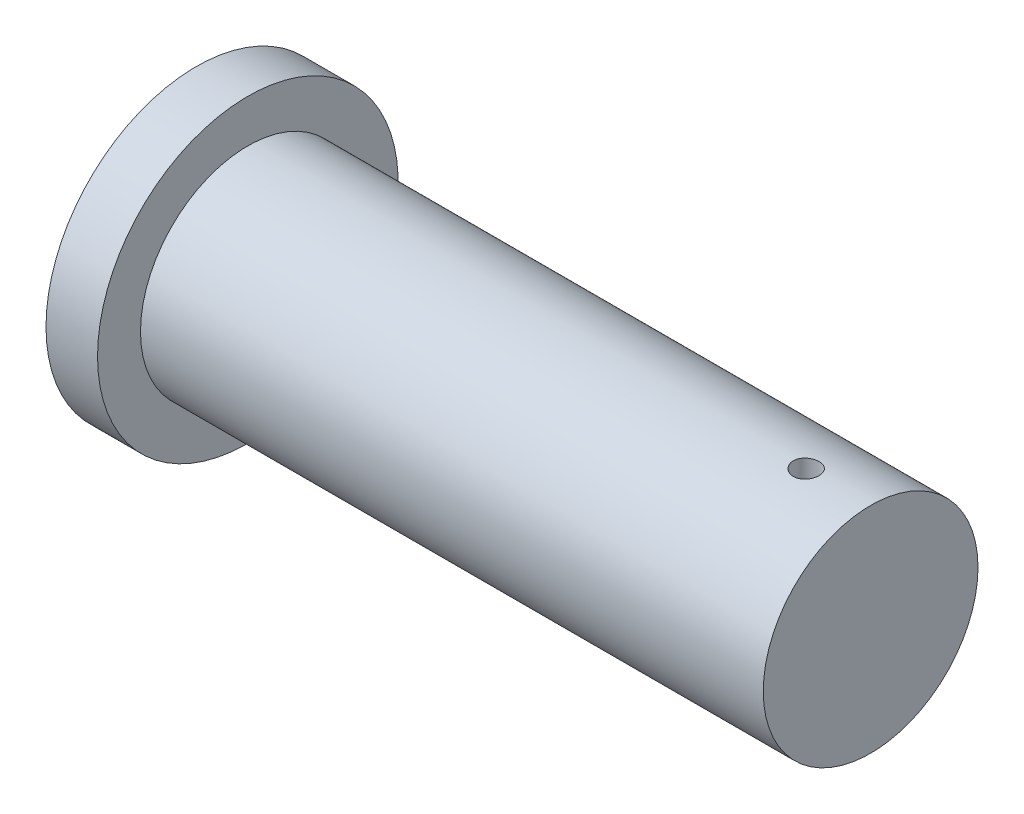
ISO-10303-21;
HEADER;
FILE_DESCRIPTION(('STEP AP214'),'2;1');
FILE_NAME('part.step','',(''),(''),'','','');
FILE_SCHEMA(('AUTOMOTIVE_DESIGN { 1 0 10303 214 1 1 1 1 }'));
ENDSEC;
DATA;
#1=APPLICATION_CONTEXT('core data for automotive mechanical design processes');
#2=APPLICATION_PROTOCOL_DEFINITION('international standard','automotive_design',2000,#1);
#3=PRODUCT_CONTEXT('',#1,'mechanical');
#4=PRODUCT('Part','Part','',(#3));
#5=PRODUCT_RELATED_PRODUCT_CATEGORY('part','',(#4));
#6=PRODUCT_DEFINITION_FORMATION('','',#4);
#7=PRODUCT_DEFINITION_CONTEXT('part definition',#1,'design');
#8=PRODUCT_DEFINITION('design','',#6,#7);
#9=PRODUCT_DEFINITION_SHAPE('','',#8);
#10=(LENGTH_UNIT() NAMED_UNIT(*) SI_UNIT(.MILLI.,.METRE.));
#11=(NAMED_UNIT(*) PLANE_ANGLE_UNIT() SI_UNIT($,.RADIAN.));
#12=(NAMED_UNIT(*) SI_UNIT($,.STERADIAN.) SOLID_ANGLE_UNIT());
#13=UNCERTAINTY_MEASURE_WITH_UNIT(LENGTH_MEASURE(1.E-05),#10,'distance_accuracy_value','');
#14=(GEOMETRIC_REPRESENTATION_CONTEXT(3) GLOBAL_UNCERTAINTY_ASSIGNED_CONTEXT((#13)) GLOBAL_UNIT_ASSIGNED_CONTEXT((#10,
#11,#12)) REPRESENTATION_CONTEXT('',''));
#15=CARTESIAN_POINT('',(0.,0.,0.));
#16=DIRECTION('',(0.,0.,1.));
#17=DIRECTION('',(1.,0.,0.));
#18=AXIS2_PLACEMENT_3D('',#15,#16,#17);
#19=CARTESIAN_POINT('',(0.,0.,0.));
#20=DIRECTION('',(-1.,0.,0.));
#21=DIRECTION('',(0.,0.,1.));
#22=AXIS2_PLACEMENT_3D('',#19,#20,#21);
#23=PLANE('',#22);
#24=CARTESIAN_POINT('',(0.,0.,0.));
#25=DIRECTION('',(-1.,0.,0.));
#26=DIRECTION('',(0.,0.,1.));
#27=AXIS2_PLACEMENT_3D('',#24,#25,#26);
#28=CIRCLE('',#27,25.);
#29=CARTESIAN_POINT('',(0.,0.,25.));
#30=VERTEX_POINT('',#29);
#31=EDGE_CURVE('E10',#30,#30,#28,.T.);
#32=ORIENTED_EDGE('',*,*,#31,.F.);
#33=EDGE_LOOP('',(#32));
#34=FACE_BOUND('',#33,.T.);
#35=ADVANCED_FACE('F37',(#34),#23,.F.);
#36=CARTESIAN_POINT('',(-157.,0.,0.));
#37=DIRECTION('',(-1.,0.,0.));
#38=DIRECTION('',(0.,0.,1.));
#39=AXIS2_PLACEMENT_3D('',#36,#37,#38);
#40=CYLINDRICAL_SURFACE('',#39,25.);
#41=CARTESIAN_POINT('',(-15.,-24.8193472919817,3.));
#42=CARTESIAN_POINT('',(-14.8321408588001,-24.819349617552,2.99999283172714));
#43=CARTESIAN_POINT('',(-14.6641754798501,-24.8210685774632,2.98586413495824));
#44=CARTESIAN_POINT('',(-14.3329153879421,-24.8277564496115,2.92972318709126));
#45=CARTESIAN_POINT('',(-14.1696258043137,-24.8327287982131,2.88768145238964));
#46=CARTESIAN_POINT('',(-13.8525615944954,-24.8453523109071,2.77696834616031));
#47=CARTESIAN_POINT('',(-13.6987807388662,-24.8530016988386,2.708314627898));
#48=CARTESIAN_POINT('',(-13.4049528578965,-24.8701152498661,2.5463633755789));
#49=CARTESIAN_POINT('',(-13.2649034084313,-24.8795790917656,2.45307020212001));
#50=CARTESIAN_POINT('',(-13.0017602283905,-24.8993100054925,2.24397143930053));
#51=CARTESIAN_POINT('',(-12.8787477056515,-24.9095805816582,2.1280639725065));
#52=CARTESIAN_POINT('',(-12.6538712818379,-24.9297361585383,1.87724586434875));
#53=CARTESIAN_POINT('',(-12.5520084140581,-24.9396211403948,1.74233429505413));
#54=CARTESIAN_POINT('',(-12.3720334670637,-24.9579274023081,1.45682956846799));
#55=CARTESIAN_POINT('',(-12.2939945842603,-24.9663441380671,1.30618995384899));
#56=CARTESIAN_POINT('',(-12.1643515396152,-24.9807271243236,0.993825767272774));
#57=CARTESIAN_POINT('',(-12.1127464702522,-24.9866934589465,0.832101576085541));
#58=CARTESIAN_POINT('',(-12.0376777438965,-24.9954787324527,0.502987856985083));
#59=CARTESIAN_POINT('',(-12.0140793465542,-24.9983127364408,0.335629471043379));
#60=CARTESIAN_POINT('',(-11.9952764006894,-25.0005654366101,-0.00069449666856503));
#61=CARTESIAN_POINT('',(-12.0000708178417,-24.9999842572034,-0.169660019668339));
#62=CARTESIAN_POINT('',(-12.0378091218513,-24.9954842925266,-0.503485667517529));
#63=CARTESIAN_POINT('',(-12.0706081049724,-24.9915826884338,-0.668362437568212));
#64=CARTESIAN_POINT('',(-12.163198151716,-24.9808996422381,-0.990254370091175));
#65=CARTESIAN_POINT('',(-12.2229896941816,-24.9741181490466,-1.1472693930426));
#66=CARTESIAN_POINT('',(-12.3680227289065,-24.9584077904553,-1.44943112325938));
#67=CARTESIAN_POINT('',(-12.4533272360064,-24.9494736188692,-1.59454729727538));
#68=CARTESIAN_POINT('',(-12.6469188989561,-24.9304580967161,-1.86845892019878));
#69=CARTESIAN_POINT('',(-12.7552070264156,-24.9203766976596,-1.99725367876689));
#70=CARTESIAN_POINT('',(-12.9925043495404,-24.9001206745296,-2.23571721123049));
#71=CARTESIAN_POINT('',(-13.1216397813735,-24.8899458632542,-2.34526038878379));
#72=CARTESIAN_POINT('',(-13.3965315136795,-24.8707126046074,-2.54113591825157));
#73=CARTESIAN_POINT('',(-13.5422878591644,-24.8616541602595,-2.62746820730525));
#74=CARTESIAN_POINT('',(-13.8463924901473,-24.8456792055215,-2.77447678358649));
#75=CARTESIAN_POINT('',(-14.0047454412579,-24.8387634934566,-2.83514351157641));
#76=CARTESIAN_POINT('',(-14.3294923595011,-24.8278728306611,-2.92899010032377));
#77=CARTESIAN_POINT('',(-14.4958859701193,-24.8238977496731,-2.96217117858551));
#78=CARTESIAN_POINT('',(-14.8308830963766,-24.8193620015637,-2.99993928712165));
#79=CARTESIAN_POINT('',(-14.9994664358811,-24.8187802560634,-3.00470284270772));
#80=CARTESIAN_POINT('',(-15.3350287808429,-24.8210413301146,-2.98596598055603));
#81=CARTESIAN_POINT('',(-15.5020078176873,-24.82388408253,-2.96246611691248));
#82=CARTESIAN_POINT('',(-15.8290957835979,-24.8326546274978,-2.88801791942018));
#83=CARTESIAN_POINT('',(-15.9892243468093,-24.8385728602158,-2.83715462498937));
#84=CARTESIAN_POINT('',(-16.2986792829759,-24.8528197853248,-2.70951076792624));
#85=CARTESIAN_POINT('',(-16.448005304503,-24.8611485560914,-2.63272936258611));
#86=CARTESIAN_POINT('',(-16.7324162949746,-24.8793287313299,-2.4549930272161));
#87=CARTESIAN_POINT('',(-16.8674282868813,-24.8891873609855,-2.35392207141476));
#88=CARTESIAN_POINT('',(-17.1186351130117,-24.9092935540369,-2.13064017836707));
#89=CARTESIAN_POINT('',(-17.2348292734058,-24.9195411313438,-2.0084284844362));
#90=CARTESIAN_POINT('',(-17.4457197472349,-24.939335094491,-1.74556427266772));
#91=CARTESIAN_POINT('',(-17.5403002465114,-24.948877525603,-1.60481849941783));
#92=CARTESIAN_POINT('',(-17.7044782093291,-24.966127243116,-1.30933642941058));
#93=CARTESIAN_POINT('',(-17.7740761423744,-24.9738345640037,-1.15460039564441));
#94=CARTESIAN_POINT('',(-17.8861210048758,-24.9865280430514,-0.835919244719984));
#95=CARTESIAN_POINT('',(-17.9286355198842,-24.9915209702628,-0.67199817064718));
#96=CARTESIAN_POINT('',(-17.9855267435821,-24.9982511364507,-0.339280584991475));
#97=CARTESIAN_POINT('',(-17.9999046166931,-24.9999885101567,-0.170484275461257));
#98=CARTESIAN_POINT('',(-18.0000938441123,-25.0000113048646,0.166060006255658));
#99=CARTESIAN_POINT('',(-17.9860840366832,-24.9983183365244,0.333807904658864));
#100=CARTESIAN_POINT('',(-17.9302735450975,-24.9917135402075,0.664547224796243));
#101=CARTESIAN_POINT('',(-17.8884728700504,-24.9868017132859,0.827538648089519));
#102=CARTESIAN_POINT('',(-17.7783219848684,-24.9743088019473,1.14411955598358));
#103=CARTESIAN_POINT('',(-17.7099796355457,-24.9667285079087,1.29771180874788));
#104=CARTESIAN_POINT('',(-17.5487039304153,-24.9497392443223,1.59127541052543));
#105=CARTESIAN_POINT('',(-17.4557703755961,-24.9403302599753,1.73124664929415));
#106=CARTESIAN_POINT('',(-17.2472863179947,-24.920663936203,1.99450948424813));
#107=CARTESIAN_POINT('',(-17.1316026446778,-24.910401817522,2.11769526787512));
#108=CARTESIAN_POINT('',(-16.8811769628439,-24.8902246865463,2.34297730712576));
#109=CARTESIAN_POINT('',(-16.7464304354851,-24.88030975725,2.44506854813713));
#110=CARTESIAN_POINT('',(-16.4611570638409,-24.8619119204259,2.62557074728252));
#111=CARTESIAN_POINT('',(-16.3105756717734,-24.8534342444192,2.70389598198192));
#112=CARTESIAN_POINT('',(-15.9983822462959,-24.8389322365013,2.8340380582164));
#113=CARTESIAN_POINT('',(-15.8367825288144,-24.8329052161653,2.88588396425552));
#114=CARTESIAN_POINT('',(-15.5619404608884,-24.8254627238532,2.94907010073915));
#115=CARTESIAN_POINT('',(-15.4504372480377,-24.8231807309863,2.96814164942005));
#116=CARTESIAN_POINT('',(-15.2259720678681,-24.8201222373143,2.99360896909453));
#117=CARTESIAN_POINT('',(-15.1130101104407,-24.8193457263061,3.00000482599459));
#118=CARTESIAN_POINT('',(-15.,-24.8193472919817,3.));
#119=B_SPLINE_CURVE_WITH_KNOTS('',3,(#41,#42,#43,#44,#45,#46,#47,#48,#49,#50,#51,#52,#53,#54,
#55,#56,#57,#58,#59,#60,#61,#62,#63,#64,#65,#66,#67,#68,#69,#70,#71,#72,#73,#74,#75,#76,#77,#78,
#79,#80,#81,#82,#83,#84,#85,#86,#87,#88,#89,#90,#91,#92,#93,#94,#95,#96,#97,#98,#99,#100,#101,
#102,#103,#104,#105,#106,#107,#108,#109,#110,#111,#112,#113,#114,#115,#116,#117,#118),
.UNSPECIFIED.,.T.,.F.,(4,2,2,2,2,2,2,2,2,2,2,2,2,2,2,2,2,2,2,2,2,2,2,2,2,2,2,2,2,2,2,2,2,2,2,2,
2,2,4),(0.,0.503164613232923,1.00686154966524,1.51022492507114,2.01349927674882,
2.51909553323416,3.02471648549883,3.53187561756201,4.03901733675556,4.54370917218765,
5.04838262225285,5.55046046161349,6.05254720809332,6.55588445357932,7.05924298138498,
7.56577244411505,8.07230327863779,8.57902260679249,9.08571948810824,9.58926554088957,
10.0928017219916,10.5947819896887,11.0967785804672,11.6012225031328,12.105684484956,
12.6127892929794,13.119884570345,13.6257094034364,14.1315133027652,14.6341406188081,
15.1367677700954,15.6392461723566,16.1417286411941,16.6472450412647,17.1528814752088,
17.6603206216507,18.1672015841626,18.5059562893408,18.8447086986815),.UNSPECIFIED.);
#120=CARTESIAN_POINT('',(-15.,-24.8193472919817,3.));
#121=VERTEX_POINT('',#120);
#122=EDGE_CURVE('E40',#121,#121,#119,.T.);
#123=ORIENTED_EDGE('',*,*,#122,.T.);
#124=EDGE_LOOP('',(#123));
#125=FACE_BOUND('',#124,.T.);
#126=CARTESIAN_POINT('',(-15.,24.8193472919817,3.));
#127=CARTESIAN_POINT('',(-15.1678591411998,24.819349617552,2.99999283172714));
#128=CARTESIAN_POINT('',(-15.3358245201498,24.8210685774632,2.98586413495824));
#129=CARTESIAN_POINT('',(-15.6670846120578,24.8277564496115,2.92972318709126));
#130=CARTESIAN_POINT('',(-15.8303741956862,24.8327287982131,2.88768145238964));
#131=CARTESIAN_POINT('',(-16.1474384055045,24.8453523109071,2.77696834616031));
#132=CARTESIAN_POINT('',(-16.3012192611337,24.8530016988386,2.708314627898));
#133=CARTESIAN_POINT('',(-16.5950471421034,24.8701152498661,2.5463633755789));
#134=CARTESIAN_POINT('',(-16.7350965915686,24.8795790917656,2.45307020212001));
#135=CARTESIAN_POINT('',(-16.9982397716095,24.8993100054925,2.24397143930053));
#136=CARTESIAN_POINT('',(-17.1212522943484,24.9095805816582,2.1280639725065));
#137=CARTESIAN_POINT('',(-17.346128718162,24.9297361585383,1.87724586434875));
#138=CARTESIAN_POINT('',(-17.4479915859418,24.9396211403948,1.74233429505413));
#139=CARTESIAN_POINT('',(-17.6279665329362,24.9579274023081,1.45682956846799));
#140=CARTESIAN_POINT('',(-17.7060054157396,24.9663441380671,1.30618995384899));
#141=CARTESIAN_POINT('',(-17.8356484603847,24.9807271243236,0.993825767272777));
#142=CARTESIAN_POINT('',(-17.8872535297477,24.9866934589465,0.832101576085543));
#143=CARTESIAN_POINT('',(-17.9623222561034,24.9954787324527,0.502987856985085));
#144=CARTESIAN_POINT('',(-17.9859206534457,24.9983127364408,0.335629471043381));
#145=CARTESIAN_POINT('',(-18.0047235993105,25.0005654366101,-0.000694496668563241));
#146=CARTESIAN_POINT('',(-17.9999291821582,24.9999842572034,-0.169660019668337));
#147=CARTESIAN_POINT('',(-17.9621908781486,24.9954842925266,-0.503485667517527));
#148=CARTESIAN_POINT('',(-17.9293918950276,24.9915826884338,-0.66836243756821));
#149=CARTESIAN_POINT('',(-17.836801848284,24.9808996422381,-0.990254370091174));
#150=CARTESIAN_POINT('',(-17.7770103058183,24.9741181490466,-1.1472693930426));
#151=CARTESIAN_POINT('',(-17.6319772710934,24.9584077904553,-1.44943112325937));
#152=CARTESIAN_POINT('',(-17.5466727639935,24.9494736188692,-1.59454729727538));
#153=CARTESIAN_POINT('',(-17.3530811010438,24.9304580967161,-1.86845892019878));
#154=CARTESIAN_POINT('',(-17.2447929735843,24.9203766976596,-1.99725367876689));
#155=CARTESIAN_POINT('',(-17.0074956504595,24.9001206745296,-2.23571721123049));
#156=CARTESIAN_POINT('',(-16.8783602186265,24.8899458632542,-2.34526038878379));
#157=CARTESIAN_POINT('',(-16.6034684863205,24.8707126046074,-2.54113591825157));
#158=CARTESIAN_POINT('',(-16.4577121408355,24.8616541602595,-2.62746820730525));
#159=CARTESIAN_POINT('',(-16.1536075098526,24.8456792055215,-2.77447678358649));
#160=CARTESIAN_POINT('',(-15.9952545587421,24.8387634934566,-2.83514351157641));
#161=CARTESIAN_POINT('',(-15.6705076404988,24.8278728306611,-2.92899010032377));
#162=CARTESIAN_POINT('',(-15.5041140298807,24.8238977496731,-2.96217117858551));
#163=CARTESIAN_POINT('',(-15.1691169036233,24.8193620015637,-2.99993928712165));
#164=CARTESIAN_POINT('',(-15.0005335641188,24.8187802560634,-3.00470284270772));
#165=CARTESIAN_POINT('',(-14.664971219157,24.8210413301146,-2.98596598055603));
#166=CARTESIAN_POINT('',(-14.4979921823126,24.82388408253,-2.96246611691248));
#167=CARTESIAN_POINT('',(-14.170904216402,24.8326546274978,-2.88801791942018));
#168=CARTESIAN_POINT('',(-14.0107756531906,24.8385728602158,-2.83715462498938));
#169=CARTESIAN_POINT('',(-13.701320717024,24.8528197853248,-2.70951076792624));
#170=CARTESIAN_POINT('',(-13.5519946954969,24.8611485560914,-2.63272936258612));
#171=CARTESIAN_POINT('',(-13.2675837050253,24.8793287313299,-2.45499302721611));
#172=CARTESIAN_POINT('',(-13.1325717131187,24.8891873609855,-2.35392207141476));
#173=CARTESIAN_POINT('',(-12.8813648869882,24.9092935540369,-2.13064017836707));
#174=CARTESIAN_POINT('',(-12.7651707265941,24.9195411313438,-2.0084284844362));
#175=CARTESIAN_POINT('',(-12.554280252765,24.939335094491,-1.74556427266772));
#176=CARTESIAN_POINT('',(-12.4596997534885,24.948877525603,-1.60481849941783));
#177=CARTESIAN_POINT('',(-12.2955217906709,24.966127243116,-1.30933642941058));
#178=CARTESIAN_POINT('',(-12.2259238576255,24.9738345640037,-1.15460039564442));
#179=CARTESIAN_POINT('',(-12.1138789951242,24.9865280430514,-0.835919244719988));
#180=CARTESIAN_POINT('',(-12.0713644801157,24.9915209702628,-0.671998170647184));
#181=CARTESIAN_POINT('',(-12.0144732564178,24.9982511364507,-0.339280584991479));
#182=CARTESIAN_POINT('',(-12.0000953833068,24.9999885101567,-0.170484275461261));
#183=CARTESIAN_POINT('',(-11.9999061558876,25.0000113048646,0.166060006255654));
#184=CARTESIAN_POINT('',(-12.0139159633167,24.9983183365244,0.333807904658861));
#185=CARTESIAN_POINT('',(-12.0697264549025,24.9917135402075,0.664547224796241));
#186=CARTESIAN_POINT('',(-12.1115271299495,24.9868017132859,0.827538648089517));
#187=CARTESIAN_POINT('',(-12.2216780151315,24.9743088019473,1.14411955598358));
#188=CARTESIAN_POINT('',(-12.2900203644542,24.9667285079087,1.29771180874788));
#189=CARTESIAN_POINT('',(-12.4512960695846,24.9497392443223,1.59127541052543));
#190=CARTESIAN_POINT('',(-12.5442296244038,24.9403302599753,1.73124664929414));
#191=CARTESIAN_POINT('',(-12.7527136820052,24.920663936203,1.99450948424813));
#192=CARTESIAN_POINT('',(-12.8683973553221,24.910401817522,2.11769526787512));
#193=CARTESIAN_POINT('',(-13.118823037156,24.8902246865463,2.34297730712576));
#194=CARTESIAN_POINT('',(-13.2535695645148,24.88030975725,2.44506854813713));
#195=CARTESIAN_POINT('',(-13.538842936159,24.8619119204259,2.62557074728252));
#196=CARTESIAN_POINT('',(-13.6894243282265,24.8534342444192,2.70389598198192));
#197=CARTESIAN_POINT('',(-14.001617753704,24.8389322365013,2.8340380582164));
#198=CARTESIAN_POINT('',(-14.1632174711855,24.8329052161653,2.88588396425552));
#199=CARTESIAN_POINT('',(-14.4380595391115,24.8254627238532,2.94907010073915));
#200=CARTESIAN_POINT('',(-14.5495627519622,24.8231807309863,2.96814164942005));
#201=CARTESIAN_POINT('',(-14.7740279321318,24.8201222373143,2.99360896909453));
#202=CARTESIAN_POINT('',(-14.8869898895592,24.8193457263061,3.00000482599459));
#203=CARTESIAN_POINT('',(-15.,24.8193472919817,3.));
#204=B_SPLINE_CURVE_WITH_KNOTS('',3,(#126,#127,#128,#129,#130,#131,#132,#133,#134,#135,#136,
#137,#138,#139,#140,#141,#142,#143,#144,#145,#146,#147,#148,#149,#150,#151,#152,#153,#154,#155,
#156,#157,#158,#159,#160,#161,#162,#163,#164,#165,#166,#167,#168,#169,#170,#171,#172,#173,#174,
#175,#176,#177,#178,#179,#180,#181,#182,#183,#184,#185,#186,#187,#188,#189,#190,#191,#192,#193,
#194,#195,#196,#197,#198,#199,#200,#201,#202,#203),.UNSPECIFIED.,.T.,.F.,(4,2,2,2,2,2,2,2,2,2,2,
2,2,2,2,2,2,2,2,2,2,2,2,2,2,2,2,2,2,2,2,2,2,2,2,2,2,2,4),(0.,0.503164613232923,1.00686154966524,
1.51022492507114,2.01349927674882,2.51909553323415,3.02471648549882,3.531875617562,
4.03901733675556,4.54370917218765,5.04838262225285,5.55046046161349,6.05254720809332,
6.55588445357932,7.05924298138498,7.56577244411506,8.07230327863779,8.57902260679249,
9.08571948810824,9.58926554088957,10.0928017219916,10.5947819896887,11.0967785804672,
11.6012225031328,12.105684484956,12.6127892929794,13.119884570345,13.6257094034364,
14.1315133027652,14.6341406188081,15.1367677700954,15.6392461723566,16.1417286411941,
16.6472450412647,17.1528814752089,17.6603206216507,18.1672015841626,18.5059562893408,
18.8447086986815),.UNSPECIFIED.);
#205=CARTESIAN_POINT('',(-15.,24.8193472919817,3.));
#206=VERTEX_POINT('',#205);
#207=EDGE_CURVE('E58',#206,#206,#204,.T.);
#208=ORIENTED_EDGE('',*,*,#207,.T.);
#209=EDGE_LOOP('',(#208));
#210=FACE_BOUND('',#209,.T.);
#211=CARTESIAN_POINT('',(-145.,0.,0.));
#212=DIRECTION('',(-1.,0.,0.));
#213=DIRECTION('',(0.,0.,1.));
#214=AXIS2_PLACEMENT_3D('',#211,#212,#213);
#215=CIRCLE('',#214,25.);
#216=CARTESIAN_POINT('',(-145.,0.,25.));
#217=VERTEX_POINT('',#216);
#218=EDGE_CURVE('E49',#217,#217,#215,.T.);
#219=ORIENTED_EDGE('',*,*,#218,.F.);
#220=EDGE_LOOP('',(#219));
#221=FACE_BOUND('',#220,.T.);
#222=ORIENTED_EDGE('',*,*,#31,.T.);
#223=EDGE_LOOP('',(#222));
#224=FACE_BOUND('',#223,.T.);
#225=ADVANCED_FACE('F64',(#125,#210,#221,#224),#40,.T.);
#226=CARTESIAN_POINT('',(-145.,25.,0.));
#227=DIRECTION('',(-1.,0.,0.));
#228=DIRECTION('',(0.,0.,1.));
#229=AXIS2_PLACEMENT_3D('',#226,#227,#228);
#230=PLANE('',#229);
#231=CARTESIAN_POINT('',(-145.,0.,0.));
#232=DIRECTION('',(-1.,0.,0.));
#233=DIRECTION('',(0.,0.,1.));
#234=AXIS2_PLACEMENT_3D('',#231,#232,#233);
#235=CIRCLE('',#234,35.);
#236=CARTESIAN_POINT('',(-145.,0.,35.));
#237=VERTEX_POINT('',#236);
#238=EDGE_CURVE('E55',#237,#237,#235,.T.);
#239=ORIENTED_EDGE('',*,*,#238,.F.);
#240=EDGE_LOOP('',(#239));
#241=FACE_BOUND('',#240,.T.);
#242=ORIENTED_EDGE('',*,*,#218,.T.);
#243=EDGE_LOOP('',(#242));
#244=FACE_BOUND('',#243,.T.);
#245=ADVANCED_FACE('F79',(#241,#244),#230,.F.);
#246=CARTESIAN_POINT('',(-157.,0.,0.));
#247=DIRECTION('',(-1.,0.,0.));
#248=DIRECTION('',(0.,0.,1.));
#249=AXIS2_PLACEMENT_3D('',#246,#247,#248);
#250=CYLINDRICAL_SURFACE('',#249,35.);
#251=CARTESIAN_POINT('',(-157.,0.,0.));
#252=DIRECTION('',(-1.,0.,0.));
#253=DIRECTION('',(0.,0.,1.));
#254=AXIS2_PLACEMENT_3D('',#251,#252,#253);
#255=CIRCLE('',#254,35.);
#256=CARTESIAN_POINT('',(-157.,0.,35.));
#257=VERTEX_POINT('',#256);
#258=EDGE_CURVE('E130',#257,#257,#255,.T.);
#259=ORIENTED_EDGE('',*,*,#258,.F.);
#260=EDGE_LOOP('',(#259));
#261=FACE_BOUND('',#260,.T.);
#262=ORIENTED_EDGE('',*,*,#238,.T.);
#263=EDGE_LOOP('',(#262));
#264=FACE_BOUND('',#263,.T.);
#265=ADVANCED_FACE('F76',(#261,#264),#250,.T.);
#266=CARTESIAN_POINT('',(-157.,35.,0.));
#267=DIRECTION('',(1.,0.,0.));
#268=DIRECTION('',(0.,0.,-1.));
#269=AXIS2_PLACEMENT_3D('',#266,#267,#268);
#270=PLANE('',#269);
#271=ORIENTED_EDGE('',*,*,#258,.T.);
#272=EDGE_LOOP('',(#271));
#273=FACE_BOUND('',#272,.T.);
#274=ADVANCED_FACE('F71',(#273),#270,.F.);
#275=CARTESIAN_POINT('',(-15.,-35.,0.));
#276=DIRECTION('',(0.,1.,0.));
#277=DIRECTION('',(0.,0.,1.));
#278=AXIS2_PLACEMENT_3D('',#275,#276,#277);
#279=CYLINDRICAL_SURFACE('',#278,3.);
#280=ORIENTED_EDGE('',*,*,#207,.F.);
#281=EDGE_LOOP('',(#280));
#282=FACE_BOUND('',#281,.T.);
#283=ORIENTED_EDGE('',*,*,#122,.F.);
#284=EDGE_LOOP('',(#283));
#285=FACE_BOUND('',#284,.T.);
#286=ADVANCED_FACE('F67',(#282,#285),#279,.F.);
#287=CLOSED_SHELL('',(#35,#225,#245,#265,#274,#286));
#288=MANIFOLD_SOLID_BREP('B2',#287);
#289=ADVANCED_BREP_SHAPE_REPRESENTATION('',(#18,#288),#14);
#290=SHAPE_DEFINITION_REPRESENTATION(#9,#289);
ENDSEC;
END-ISO-10303-21;
